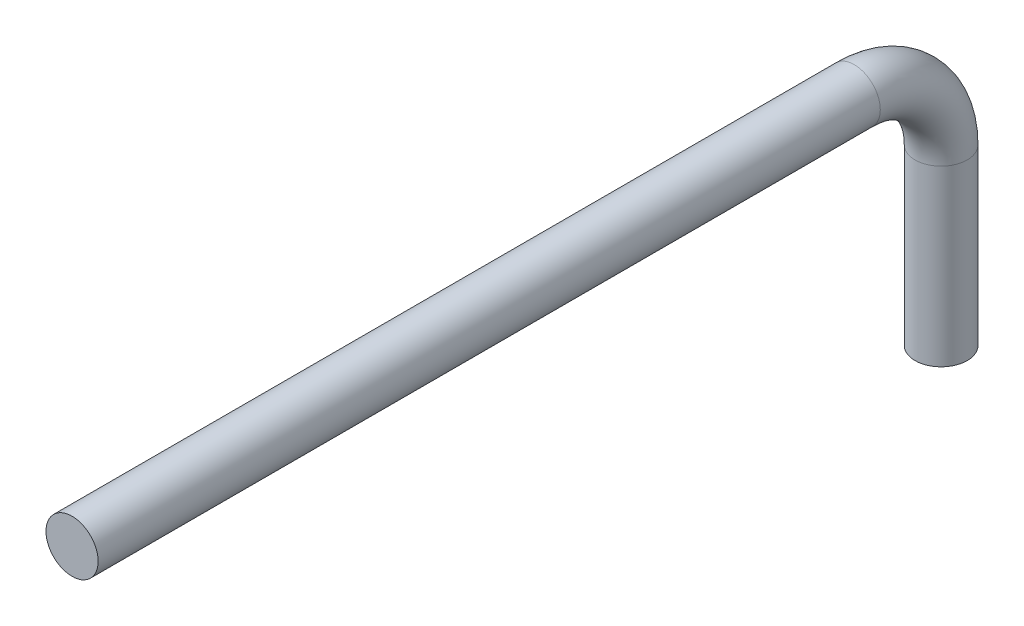
ISO-10303-21;
HEADER;
FILE_DESCRIPTION(('STEP AP214'),'2;1');
FILE_NAME('part.step','',(''),(''),'','','');
FILE_SCHEMA(('AUTOMOTIVE_DESIGN { 1 0 10303 214 1 1 1 1 }'));
ENDSEC;
DATA;
#1=APPLICATION_CONTEXT('core data for automotive mechanical design processes');
#2=APPLICATION_PROTOCOL_DEFINITION('international standard','automotive_design',2000,#1);
#3=PRODUCT_CONTEXT('',#1,'mechanical');
#4=PRODUCT('Part','Part','',(#3));
#5=PRODUCT_RELATED_PRODUCT_CATEGORY('part','',(#4));
#6=PRODUCT_DEFINITION_FORMATION('','',#4);
#7=PRODUCT_DEFINITION_CONTEXT('part definition',#1,'design');
#8=PRODUCT_DEFINITION('design','',#6,#7);
#9=PRODUCT_DEFINITION_SHAPE('','',#8);
#10=(LENGTH_UNIT() NAMED_UNIT(*) SI_UNIT(.MILLI.,.METRE.));
#11=(NAMED_UNIT(*) PLANE_ANGLE_UNIT() SI_UNIT($,.RADIAN.));
#12=(NAMED_UNIT(*) SI_UNIT($,.STERADIAN.) SOLID_ANGLE_UNIT());
#13=UNCERTAINTY_MEASURE_WITH_UNIT(LENGTH_MEASURE(1.E-05),#10,'distance_accuracy_value','');
#14=(GEOMETRIC_REPRESENTATION_CONTEXT(3) GLOBAL_UNCERTAINTY_ASSIGNED_CONTEXT((#13)) GLOBAL_UNIT_ASSIGNED_CONTEXT((#10,
#11,#12)) REPRESENTATION_CONTEXT('',''));
#15=CARTESIAN_POINT('',(0.,0.,0.));
#16=DIRECTION('',(0.,0.,1.));
#17=DIRECTION('',(1.,0.,0.));
#18=AXIS2_PLACEMENT_3D('',#15,#16,#17);
#19=CARTESIAN_POINT('',(0.,0.,0.));
#20=DIRECTION('',(0.,1.,0.));
#21=DIRECTION('',(0.,0.,1.));
#22=AXIS2_PLACEMENT_3D('',#19,#20,#21);
#23=PLANE('',#22);
#24=CARTESIAN_POINT('',(0.,0.,0.));
#25=DIRECTION('',(0.,1.,0.));
#26=DIRECTION('',(0.,0.,1.));
#27=AXIS2_PLACEMENT_3D('',#24,#25,#26);
#28=CIRCLE('',#27,3.);
#29=CARTESIAN_POINT('',(0.,0.,3.));
#30=VERTEX_POINT('',#29);
#31=EDGE_CURVE('E51',#30,#30,#28,.T.);
#32=ORIENTED_EDGE('',*,*,#31,.F.);
#33=EDGE_LOOP('',(#32));
#34=FACE_BOUND('',#33,.T.);
#35=ADVANCED_FACE('F37',(#34),#23,.F.);
#36=CARTESIAN_POINT('',(0.,30.,100.));
#37=DIRECTION('',(0.,0.,1.));
#38=DIRECTION('',(0.,-1.,0.));
#39=AXIS2_PLACEMENT_3D('',#36,#37,#38);
#40=PLANE('',#39);
#41=CARTESIAN_POINT('',(0.,30.,100.));
#42=DIRECTION('',(0.,0.,1.));
#43=DIRECTION('',(0.,-1.,0.));
#44=AXIS2_PLACEMENT_3D('',#41,#42,#43);
#45=CIRCLE('',#44,3.);
#46=CARTESIAN_POINT('',(0.,27.,100.));
#47=VERTEX_POINT('',#46);
#48=EDGE_CURVE('E10',#47,#47,#45,.T.);
#49=ORIENTED_EDGE('',*,*,#48,.T.);
#50=EDGE_LOOP('',(#49));
#51=FACE_BOUND('',#50,.T.);
#52=ADVANCED_FACE('F60',(#51),#40,.T.);
#53=CARTESIAN_POINT('',(0.,0.,0.));
#54=DIRECTION('',(0.,1.,0.));
#55=DIRECTION('',(0.,0.,1.));
#56=AXIS2_PLACEMENT_3D('',#53,#54,#55);
#57=CYLINDRICAL_SURFACE('',#56,3.);
#58=CARTESIAN_POINT('',(0.,20.,0.));
#59=DIRECTION('',(0.,1.,0.));
#60=DIRECTION('',(0.,0.,1.));
#61=AXIS2_PLACEMENT_3D('',#58,#59,#60);
#62=CIRCLE('',#61,3.);
#63=CARTESIAN_POINT('',(0.,20.,-3.));
#64=VERTEX_POINT('',#63);
#65=EDGE_CURVE('E47',#64,#64,#62,.T.);
#66=ORIENTED_EDGE('',*,*,#65,.F.);
#67=EDGE_LOOP('',(#66));
#68=FACE_BOUND('',#67,.T.);
#69=ORIENTED_EDGE('',*,*,#31,.T.);
#70=EDGE_LOOP('',(#69));
#71=FACE_BOUND('',#70,.T.);
#72=ADVANCED_FACE('F57',(#68,#71),#57,.T.);
#73=CARTESIAN_POINT('',(0.,20.,10.));
#74=DIRECTION('',(1.,0.,0.));
#75=DIRECTION('',(0.,0.,-1.));
#76=AXIS2_PLACEMENT_3D('',#73,#74,#75);
#77=TOROIDAL_SURFACE('',#76,10.,3.);
#78=CARTESIAN_POINT('',(0.,30.,10.));
#79=DIRECTION('',(0.,0.,1.));
#80=DIRECTION('',(0.,-1.,0.));
#81=AXIS2_PLACEMENT_3D('',#78,#79,#80);
#82=CIRCLE('',#81,3.);
#83=CARTESIAN_POINT('',(0.,33.,10.));
#84=VERTEX_POINT('',#83);
#85=EDGE_CURVE('E43',#84,#84,#82,.T.);
#86=CARTESIAN_POINT('',(0.,20.,10.));
#87=DIRECTION('',(1.,0.,0.));
#88=DIRECTION('',(0.,0.,-1.));
#89=AXIS2_PLACEMENT_3D('',#86,#87,#88);
#90=CIRCLE('',#89,13.);
#91=EDGE_CURVE('',#64,#84,#90,.T.);
#92=ORIENTED_EDGE('',*,*,#65,.T.);
#93=ORIENTED_EDGE('',*,*,#85,.F.);
#94=ORIENTED_EDGE('',*,*,#91,.T.);
#95=ORIENTED_EDGE('',*,*,#91,.F.);
#96=EDGE_LOOP('',(#92,#94,#93,#95));
#97=FACE_BOUND('',#96,.T.);
#98=ADVANCED_FACE('F66',(#97),#77,.T.);
#99=CARTESIAN_POINT('',(0.,30.,10.));
#100=DIRECTION('',(0.,0.,1.));
#101=DIRECTION('',(1.,0.,0.));
#102=AXIS2_PLACEMENT_3D('',#99,#100,#101);
#103=CYLINDRICAL_SURFACE('',#102,3.);
#104=ORIENTED_EDGE('',*,*,#48,.F.);
#105=EDGE_LOOP('',(#104));
#106=FACE_BOUND('',#105,.T.);
#107=ORIENTED_EDGE('',*,*,#85,.T.);
#108=EDGE_LOOP('',(#107));
#109=FACE_BOUND('',#108,.T.);
#110=ADVANCED_FACE('F64',(#106,#109),#103,.T.);
#111=CLOSED_SHELL('',(#35,#52,#72,#98,#110));
#112=MANIFOLD_SOLID_BREP('B2',#111);
#113=ADVANCED_BREP_SHAPE_REPRESENTATION('',(#18,#112),#14);
#114=SHAPE_DEFINITION_REPRESENTATION(#9,#113);
ENDSEC;
END-ISO-10303-21;
